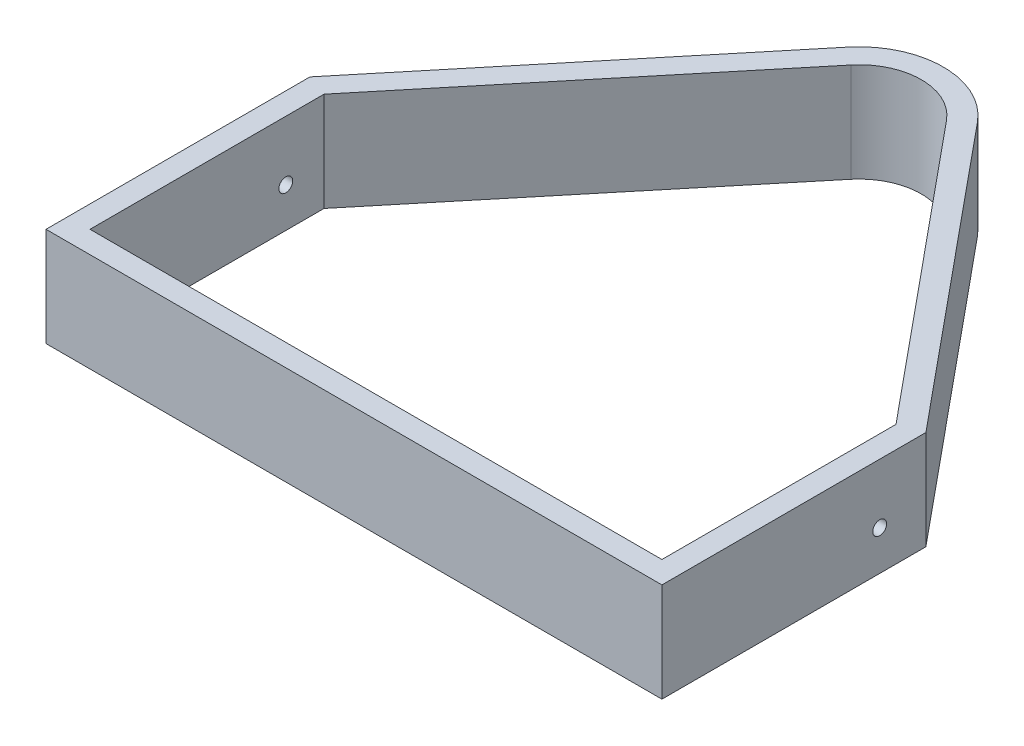
ISO-10303-21;
HEADER;
FILE_DESCRIPTION(('STEP AP214'),'2;1');
FILE_NAME('part.step','',(''),(''),'','','');
FILE_SCHEMA(('AUTOMOTIVE_DESIGN { 1 0 10303 214 1 1 1 1 }'));
ENDSEC;
DATA;
#1=APPLICATION_CONTEXT('core data for automotive mechanical design processes');
#2=APPLICATION_PROTOCOL_DEFINITION('international standard','automotive_design',2000,#1);
#3=PRODUCT_CONTEXT('',#1,'mechanical');
#4=PRODUCT('Part','Part','',(#3));
#5=PRODUCT_RELATED_PRODUCT_CATEGORY('part','',(#4));
#6=PRODUCT_DEFINITION_FORMATION('','',#4);
#7=PRODUCT_DEFINITION_CONTEXT('part definition',#1,'design');
#8=PRODUCT_DEFINITION('design','',#6,#7);
#9=PRODUCT_DEFINITION_SHAPE('','',#8);
#10=(LENGTH_UNIT() NAMED_UNIT(*) SI_UNIT(.MILLI.,.METRE.));
#11=(NAMED_UNIT(*) PLANE_ANGLE_UNIT() SI_UNIT($,.RADIAN.));
#12=(NAMED_UNIT(*) SI_UNIT($,.STERADIAN.) SOLID_ANGLE_UNIT());
#13=UNCERTAINTY_MEASURE_WITH_UNIT(LENGTH_MEASURE(1.E-05),#10,'distance_accuracy_value','');
#14=(GEOMETRIC_REPRESENTATION_CONTEXT(3) GLOBAL_UNCERTAINTY_ASSIGNED_CONTEXT((#13)) GLOBAL_UNIT_ASSIGNED_CONTEXT((#10,
#11,#12)) REPRESENTATION_CONTEXT('',''));
#15=CARTESIAN_POINT('',(0.,0.,0.));
#16=DIRECTION('',(0.,0.,1.));
#17=DIRECTION('',(1.,0.,0.));
#18=AXIS2_PLACEMENT_3D('',#15,#16,#17);
#19=CARTESIAN_POINT('',(0.,28.575,-145.86307345283));
#20=DIRECTION('',(0.,-1.,0.));
#21=DIRECTION('',(0.,0.,-1.));
#22=AXIS2_PLACEMENT_3D('',#19,#20,#21);
#23=PLANE('',#22);
#24=DIRECTION('',(0.,0.,-1.));
#25=VECTOR('',#24,1.);
#26=CARTESIAN_POINT('',(88.9,28.575,0.));
#27=LINE('',#26,#25);
#28=CARTESIAN_POINT('',(88.9,28.575,0.));
#29=VERTEX_POINT('',#28);
#30=CARTESIAN_POINT('',(88.9,28.575,-76.2));
#31=VERTEX_POINT('',#30);
#32=EDGE_CURVE('E177',#29,#31,#27,.T.);
#33=ORIENTED_EDGE('',*,*,#32,.T.);
#34=DIRECTION('',(-0.636363636363636,0.,-0.77138921583987));
#35=VECTOR('',#34,1.);
#36=CARTESIAN_POINT('',(18.7026821694994,28.575,-161.291999072665));
#37=LINE('',#36,#35);
#38=CARTESIAN_POINT('',(18.7026821694994,28.575,-161.291999072665));
#39=VERTEX_POINT('',#38);
#40=EDGE_CURVE('E180',#31,#39,#37,.T.);
#41=ORIENTED_EDGE('',*,*,#40,.T.);
#42=CARTESIAN_POINT('',(0.,28.575,-145.86307345283));
#43=DIRECTION('',(0.,1.,0.));
#44=DIRECTION('',(0.,0.,-1.));
#45=AXIS2_PLACEMENT_3D('',#42,#43,#44);
#46=CIRCLE('',#45,24.2454545454545);
#47=CARTESIAN_POINT('',(-18.7026821694994,28.575,-161.291999072665));
#48=VERTEX_POINT('',#47);
#49=EDGE_CURVE('E183',#39,#48,#46,.T.);
#50=ORIENTED_EDGE('',*,*,#49,.T.);
#51=DIRECTION('',(-0.636363636363636,0.,0.77138921583987));
#52=VECTOR('',#51,1.);
#53=CARTESIAN_POINT('',(-88.9,28.575,-76.2));
#54=LINE('',#53,#52);
#55=CARTESIAN_POINT('',(-88.9,28.575,-76.2));
#56=VERTEX_POINT('',#55);
#57=EDGE_CURVE('E185',#48,#56,#54,.T.);
#58=ORIENTED_EDGE('',*,*,#57,.T.);
#59=DIRECTION('',(0.,0.,1.));
#60=VECTOR('',#59,1.);
#61=CARTESIAN_POINT('',(-88.9,28.575,0.));
#62=LINE('',#61,#60);
#63=CARTESIAN_POINT('',(-88.9,28.575,0.));
#64=VERTEX_POINT('',#63);
#65=EDGE_CURVE('E187',#56,#64,#62,.T.);
#66=ORIENTED_EDGE('',*,*,#65,.T.);
#67=DIRECTION('',(1.,0.,0.));
#68=VECTOR('',#67,1.);
#69=CARTESIAN_POINT('',(-88.9,28.575,0.));
#70=LINE('',#69,#68);
#71=EDGE_CURVE('E189',#64,#29,#70,.T.);
#72=ORIENTED_EDGE('',*,*,#71,.T.);
#73=EDGE_LOOP('',(#33,#41,#50,#58,#66,#72));
#74=FACE_BOUND('',#73,.T.);
#75=DIRECTION('',(1.,0.,0.));
#76=VECTOR('',#75,1.);
#77=CARTESIAN_POINT('',(-82.55,28.575,-6.35));
#78=LINE('',#77,#76);
#79=CARTESIAN_POINT('',(-82.55,28.575,-6.35));
#80=VERTEX_POINT('',#79);
#81=CARTESIAN_POINT('',(82.55,28.575,-6.35));
#82=VERTEX_POINT('',#81);
#83=EDGE_CURVE('E124',#80,#82,#78,.T.);
#84=ORIENTED_EDGE('',*,*,#83,.F.);
#85=DIRECTION('',(0.,0.,1.));
#86=VECTOR('',#85,1.);
#87=CARTESIAN_POINT('',(-82.55,28.575,-6.35));
#88=LINE('',#87,#86);
#89=CARTESIAN_POINT('',(-82.55,28.575,-73.9187909609164));
#90=VERTEX_POINT('',#89);
#91=EDGE_CURVE('E154',#90,#80,#88,.T.);
#92=ORIENTED_EDGE('',*,*,#91,.F.);
#93=DIRECTION('',(-0.636363636363636,0.,0.77138921583987));
#94=VECTOR('',#93,1.);
#95=CARTESIAN_POINT('',(-82.55,28.575,-73.9187909609164));
#96=LINE('',#95,#94);
#97=CARTESIAN_POINT('',(-13.8043606489163,28.575,-157.251089981755));
#98=VERTEX_POINT('',#97);
#99=EDGE_CURVE('E152',#98,#90,#96,.T.);
#100=ORIENTED_EDGE('',*,*,#99,.F.);
#101=CARTESIAN_POINT('',(0.,28.575,-145.86307345283));
#102=DIRECTION('',(0.,1.,0.));
#103=DIRECTION('',(0.,0.,-1.));
#104=AXIS2_PLACEMENT_3D('',#101,#102,#103);
#105=CIRCLE('',#104,17.8954545454546);
#106=CARTESIAN_POINT('',(13.8043606489162,28.575,-157.251089981755));
#107=VERTEX_POINT('',#106);
#108=EDGE_CURVE('E147',#107,#98,#105,.T.);
#109=ORIENTED_EDGE('',*,*,#108,.F.);
#110=DIRECTION('',(-0.636363636363636,0.,-0.77138921583987));
#111=VECTOR('',#110,1.);
#112=CARTESIAN_POINT('',(13.8043606489162,28.575,-157.251089981755));
#113=LINE('',#112,#111);
#114=CARTESIAN_POINT('',(82.55,28.575,-73.9187909609164));
#115=VERTEX_POINT('',#114);
#116=EDGE_CURVE('E145',#115,#107,#113,.T.);
#117=ORIENTED_EDGE('',*,*,#116,.F.);
#118=DIRECTION('',(0.,0.,-1.));
#119=VECTOR('',#118,1.);
#120=CARTESIAN_POINT('',(82.55,28.575,-6.35));
#121=LINE('',#120,#119);
#122=EDGE_CURVE('E132',#82,#115,#121,.T.);
#123=ORIENTED_EDGE('',*,*,#122,.F.);
#124=EDGE_LOOP('',(#84,#92,#100,#109,#117,#123));
#125=FACE_BOUND('',#124,.T.);
#126=ADVANCED_FACE('F35',(#74,#125),#23,.F.);
#127=CARTESIAN_POINT('',(0.,0.,-145.86307345283));
#128=DIRECTION('',(0.,-1.,0.));
#129=DIRECTION('',(0.,0.,-1.));
#130=AXIS2_PLACEMENT_3D('',#127,#128,#129);
#131=PLANE('',#130);
#132=DIRECTION('',(0.,0.,-1.));
#133=VECTOR('',#132,1.);
#134=CARTESIAN_POINT('',(88.9,0.,0.));
#135=LINE('',#134,#133);
#136=CARTESIAN_POINT('',(88.9,0.,0.));
#137=VERTEX_POINT('',#136);
#138=CARTESIAN_POINT('',(88.9,0.,-76.2));
#139=VERTEX_POINT('',#138);
#140=EDGE_CURVE('E140',#137,#139,#135,.T.);
#141=ORIENTED_EDGE('',*,*,#140,.F.);
#142=DIRECTION('',(1.,0.,0.));
#143=VECTOR('',#142,1.);
#144=CARTESIAN_POINT('',(-88.9,0.,0.));
#145=LINE('',#144,#143);
#146=CARTESIAN_POINT('',(-88.9,0.,0.));
#147=VERTEX_POINT('',#146);
#148=EDGE_CURVE('E181',#147,#137,#145,.T.);
#149=ORIENTED_EDGE('',*,*,#148,.F.);
#150=DIRECTION('',(0.,0.,1.));
#151=VECTOR('',#150,1.);
#152=CARTESIAN_POINT('',(-88.9,0.,0.));
#153=LINE('',#152,#151);
#154=CARTESIAN_POINT('',(-88.9,0.,-76.2));
#155=VERTEX_POINT('',#154);
#156=EDGE_CURVE('E200',#155,#147,#153,.T.);
#157=ORIENTED_EDGE('',*,*,#156,.F.);
#158=DIRECTION('',(-0.636363636363636,0.,0.77138921583987));
#159=VECTOR('',#158,1.);
#160=CARTESIAN_POINT('',(-88.9,0.,-76.2));
#161=LINE('',#160,#159);
#162=CARTESIAN_POINT('',(-18.7026821694994,0.,-161.291999072665));
#163=VERTEX_POINT('',#162);
#164=EDGE_CURVE('E198',#163,#155,#161,.T.);
#165=ORIENTED_EDGE('',*,*,#164,.F.);
#166=CARTESIAN_POINT('',(0.,0.,-145.86307345283));
#167=DIRECTION('',(0.,1.,0.));
#168=DIRECTION('',(0.,0.,-1.));
#169=AXIS2_PLACEMENT_3D('',#166,#167,#168);
#170=CIRCLE('',#169,24.2454545454545);
#171=CARTESIAN_POINT('',(18.7026821694994,0.,-161.291999072665));
#172=VERTEX_POINT('',#171);
#173=EDGE_CURVE('E196',#172,#163,#170,.T.);
#174=ORIENTED_EDGE('',*,*,#173,.F.);
#175=DIRECTION('',(-0.636363636363636,0.,-0.77138921583987));
#176=VECTOR('',#175,1.);
#177=CARTESIAN_POINT('',(18.7026821694994,0.,-161.291999072665));
#178=LINE('',#177,#176);
#179=EDGE_CURVE('E194',#139,#172,#178,.T.);
#180=ORIENTED_EDGE('',*,*,#179,.F.);
#181=EDGE_LOOP('',(#141,#149,#157,#165,#174,#180));
#182=FACE_BOUND('',#181,.T.);
#183=DIRECTION('',(0.,0.,1.));
#184=VECTOR('',#183,1.);
#185=CARTESIAN_POINT('',(-82.55,0.,-6.35));
#186=LINE('',#185,#184);
#187=CARTESIAN_POINT('',(-82.55,0.,-73.9187909609164));
#188=VERTEX_POINT('',#187);
#189=CARTESIAN_POINT('',(-82.55,0.,-6.34999999999999));
#190=VERTEX_POINT('',#189);
#191=EDGE_CURVE('E133',#188,#190,#186,.T.);
#192=ORIENTED_EDGE('',*,*,#191,.T.);
#193=DIRECTION('',(1.,0.,0.));
#194=VECTOR('',#193,1.);
#195=CARTESIAN_POINT('',(-82.55,0.,-6.35));
#196=LINE('',#195,#194);
#197=CARTESIAN_POINT('',(82.55,0.,-6.35));
#198=VERTEX_POINT('',#197);
#199=EDGE_CURVE('E58',#190,#198,#196,.T.);
#200=ORIENTED_EDGE('',*,*,#199,.T.);
#201=DIRECTION('',(0.,0.,-1.));
#202=VECTOR('',#201,1.);
#203=CARTESIAN_POINT('',(82.55,0.,-6.35));
#204=LINE('',#203,#202);
#205=CARTESIAN_POINT('',(82.55,0.,-73.9187909609164));
#206=VERTEX_POINT('',#205);
#207=EDGE_CURVE('E139',#198,#206,#204,.T.);
#208=ORIENTED_EDGE('',*,*,#207,.T.);
#209=DIRECTION('',(-0.636363636363636,0.,-0.77138921583987));
#210=VECTOR('',#209,1.);
#211=CARTESIAN_POINT('',(13.8043606489162,0.,-157.251089981755));
#212=LINE('',#211,#210);
#213=CARTESIAN_POINT('',(13.8043606489162,0.,-157.251089981755));
#214=VERTEX_POINT('',#213);
#215=EDGE_CURVE('E159',#206,#214,#212,.T.);
#216=ORIENTED_EDGE('',*,*,#215,.T.);
#217=CARTESIAN_POINT('',(0.,0.,-145.86307345283));
#218=DIRECTION('',(0.,1.,0.));
#219=DIRECTION('',(0.,0.,-1.));
#220=AXIS2_PLACEMENT_3D('',#217,#218,#219);
#221=CIRCLE('',#220,17.8954545454546);
#222=CARTESIAN_POINT('',(-13.8043606489163,0.,-157.251089981755));
#223=VERTEX_POINT('',#222);
#224=EDGE_CURVE('E162',#214,#223,#221,.T.);
#225=ORIENTED_EDGE('',*,*,#224,.T.);
#226=DIRECTION('',(-0.636363636363636,0.,0.77138921583987));
#227=VECTOR('',#226,1.);
#228=CARTESIAN_POINT('',(-82.55,0.,-73.9187909609164));
#229=LINE('',#228,#227);
#230=EDGE_CURVE('E165',#223,#188,#229,.T.);
#231=ORIENTED_EDGE('',*,*,#230,.T.);
#232=EDGE_LOOP('',(#192,#200,#208,#216,#225,#231));
#233=FACE_BOUND('',#232,.T.);
#234=ADVANCED_FACE('F224',(#182,#233),#131,.T.);
#235=CARTESIAN_POINT('',(88.9,28.575,0.));
#236=DIRECTION('',(-1.,0.,0.));
#237=DIRECTION('',(0.,0.,1.));
#238=AXIS2_PLACEMENT_3D('',#235,#236,#237);
#239=PLANE('',#238);
#240=CARTESIAN_POINT('',(88.9,11.43,-62.8697909609164));
#241=DIRECTION('',(-1.,0.,0.));
#242=DIRECTION('',(0.,0.,1.));
#243=AXIS2_PLACEMENT_3D('',#240,#241,#242);
#244=CIRCLE('',#243,2.);
#245=CARTESIAN_POINT('',(88.9,11.43,-60.8697909609164));
#246=VERTEX_POINT('',#245);
#247=EDGE_CURVE('E295',#246,#246,#244,.F.);
#248=ORIENTED_EDGE('',*,*,#247,.F.);
#249=EDGE_LOOP('',(#248));
#250=FACE_BOUND('',#249,.T.);
#251=ORIENTED_EDGE('',*,*,#140,.T.);
#252=DIRECTION('',(0.,-1.,0.));
#253=VECTOR('',#252,1.);
#254=CARTESIAN_POINT('',(88.9,28.575,-76.2));
#255=LINE('',#254,#253);
#256=EDGE_CURVE('E11',#31,#139,#255,.T.);
#257=ORIENTED_EDGE('',*,*,#256,.F.);
#258=ORIENTED_EDGE('',*,*,#32,.F.);
#259=DIRECTION('',(0.,-1.,0.));
#260=VECTOR('',#259,1.);
#261=CARTESIAN_POINT('',(88.9,28.575,0.));
#262=LINE('',#261,#260);
#263=EDGE_CURVE('E191',#29,#137,#262,.T.);
#264=ORIENTED_EDGE('',*,*,#263,.T.);
#265=EDGE_LOOP('',(#251,#257,#258,#264));
#266=FACE_BOUND('',#265,.T.);
#267=ADVANCED_FACE('F37',(#250,#266),#239,.F.);
#268=CARTESIAN_POINT('',(18.7026821694994,28.575,-161.291999072665));
#269=DIRECTION('',(-0.77138921583987,0.,0.636363636363636));
#270=DIRECTION('',(0.636363636363636,0.,0.77138921583987));
#271=AXIS2_PLACEMENT_3D('',#268,#269,#270);
#272=PLANE('',#271);
#273=ORIENTED_EDGE('',*,*,#179,.T.);
#274=DIRECTION('',(0.,-1.,0.));
#275=VECTOR('',#274,1.);
#276=CARTESIAN_POINT('',(18.7026821694994,28.575,-161.291999072665));
#277=LINE('',#276,#275);
#278=EDGE_CURVE('E43',#39,#172,#277,.T.);
#279=ORIENTED_EDGE('',*,*,#278,.F.);
#280=ORIENTED_EDGE('',*,*,#40,.F.);
#281=ORIENTED_EDGE('',*,*,#256,.T.);
#282=EDGE_LOOP('',(#273,#279,#280,#281));
#283=FACE_BOUND('',#282,.T.);
#284=ADVANCED_FACE('F241',(#283),#272,.F.);
#285=CARTESIAN_POINT('',(0.,28.575,-145.86307345283));
#286=DIRECTION('',(0.,-1.,0.));
#287=DIRECTION('',(0.,0.,-1.));
#288=AXIS2_PLACEMENT_3D('',#285,#286,#287);
#289=CYLINDRICAL_SURFACE('',#288,24.2454545454545);
#290=ORIENTED_EDGE('',*,*,#173,.T.);
#291=DIRECTION('',(0.,-1.,0.));
#292=VECTOR('',#291,1.);
#293=CARTESIAN_POINT('',(-18.7026821694994,28.575,-161.291999072665));
#294=LINE('',#293,#292);
#295=EDGE_CURVE('E211',#48,#163,#294,.T.);
#296=ORIENTED_EDGE('',*,*,#295,.F.);
#297=ORIENTED_EDGE('',*,*,#49,.F.);
#298=ORIENTED_EDGE('',*,*,#278,.T.);
#299=EDGE_LOOP('',(#290,#296,#297,#298));
#300=FACE_BOUND('',#299,.T.);
#301=ADVANCED_FACE('F218',(#300),#289,.T.);
#302=CARTESIAN_POINT('',(-88.9,28.575,-76.2));
#303=DIRECTION('',(0.77138921583987,0.,0.636363636363636));
#304=DIRECTION('',(0.636363636363636,0.,-0.77138921583987));
#305=AXIS2_PLACEMENT_3D('',#302,#303,#304);
#306=PLANE('',#305);
#307=ORIENTED_EDGE('',*,*,#164,.T.);
#308=DIRECTION('',(0.,-1.,0.));
#309=VECTOR('',#308,1.);
#310=CARTESIAN_POINT('',(-88.9,28.575,-76.2));
#311=LINE('',#310,#309);
#312=EDGE_CURVE('E208',#56,#155,#311,.T.);
#313=ORIENTED_EDGE('',*,*,#312,.F.);
#314=ORIENTED_EDGE('',*,*,#57,.F.);
#315=ORIENTED_EDGE('',*,*,#295,.T.);
#316=EDGE_LOOP('',(#307,#313,#314,#315));
#317=FACE_BOUND('',#316,.T.);
#318=ADVANCED_FACE('F230',(#317),#306,.F.);
#319=CARTESIAN_POINT('',(-88.9,28.575,0.));
#320=DIRECTION('',(1.,0.,0.));
#321=DIRECTION('',(0.,0.,-1.));
#322=AXIS2_PLACEMENT_3D('',#319,#320,#321);
#323=PLANE('',#322);
#324=CARTESIAN_POINT('',(-88.9,11.43,-62.8697909609164));
#325=DIRECTION('',(1.,0.,0.));
#326=DIRECTION('',(0.,0.,-1.));
#327=AXIS2_PLACEMENT_3D('',#324,#325,#326);
#328=CIRCLE('',#327,2.);
#329=CARTESIAN_POINT('',(-88.9,11.43,-64.8697909609164));
#330=VERTEX_POINT('',#329);
#331=EDGE_CURVE('E157',#330,#330,#328,.F.);
#332=ORIENTED_EDGE('',*,*,#331,.F.);
#333=EDGE_LOOP('',(#332));
#334=FACE_BOUND('',#333,.T.);
#335=ORIENTED_EDGE('',*,*,#156,.T.);
#336=DIRECTION('',(0.,-1.,0.));
#337=VECTOR('',#336,1.);
#338=CARTESIAN_POINT('',(-88.9,28.575,0.));
#339=LINE('',#338,#337);
#340=EDGE_CURVE('E205',#64,#147,#339,.T.);
#341=ORIENTED_EDGE('',*,*,#340,.F.);
#342=ORIENTED_EDGE('',*,*,#65,.F.);
#343=ORIENTED_EDGE('',*,*,#312,.T.);
#344=EDGE_LOOP('',(#335,#341,#342,#343));
#345=FACE_BOUND('',#344,.T.);
#346=ADVANCED_FACE('F234',(#334,#345),#323,.F.);
#347=CARTESIAN_POINT('',(-88.9,28.575,0.));
#348=DIRECTION('',(0.,0.,-1.));
#349=DIRECTION('',(-1.,0.,0.));
#350=AXIS2_PLACEMENT_3D('',#347,#348,#349);
#351=PLANE('',#350);
#352=ORIENTED_EDGE('',*,*,#148,.T.);
#353=ORIENTED_EDGE('',*,*,#263,.F.);
#354=ORIENTED_EDGE('',*,*,#71,.F.);
#355=ORIENTED_EDGE('',*,*,#340,.T.);
#356=EDGE_LOOP('',(#352,#353,#354,#355));
#357=FACE_BOUND('',#356,.T.);
#358=ADVANCED_FACE('F244',(#357),#351,.F.);
#359=CARTESIAN_POINT('',(-82.55,28.575,-6.35));
#360=DIRECTION('',(0.,0.,-1.));
#361=DIRECTION('',(-1.,0.,0.));
#362=AXIS2_PLACEMENT_3D('',#359,#360,#361);
#363=PLANE('',#362);
#364=ORIENTED_EDGE('',*,*,#199,.F.);
#365=DIRECTION('',(0.,-1.,0.));
#366=VECTOR('',#365,1.);
#367=CARTESIAN_POINT('',(-82.55,28.575,-6.35));
#368=LINE('',#367,#366);
#369=EDGE_CURVE('E128',#80,#190,#368,.T.);
#370=ORIENTED_EDGE('',*,*,#369,.F.);
#371=ORIENTED_EDGE('',*,*,#83,.T.);
#372=DIRECTION('',(0.,-1.,0.));
#373=VECTOR('',#372,1.);
#374=CARTESIAN_POINT('',(82.55,28.575,-6.35));
#375=LINE('',#374,#373);
#376=EDGE_CURVE('E127',#82,#198,#375,.T.);
#377=ORIENTED_EDGE('',*,*,#376,.T.);
#378=EDGE_LOOP('',(#364,#370,#371,#377));
#379=FACE_BOUND('',#378,.T.);
#380=ADVANCED_FACE('F126',(#379),#363,.T.);
#381=CARTESIAN_POINT('',(82.55,28.575,-6.35));
#382=DIRECTION('',(-1.,0.,0.));
#383=DIRECTION('',(0.,0.,1.));
#384=AXIS2_PLACEMENT_3D('',#381,#382,#383);
#385=PLANE('',#384);
#386=CARTESIAN_POINT('',(82.55,11.43,-62.8697909609164));
#387=DIRECTION('',(-1.,0.,0.));
#388=DIRECTION('',(0.,0.,1.));
#389=AXIS2_PLACEMENT_3D('',#386,#387,#388);
#390=CIRCLE('',#389,2.);
#391=CARTESIAN_POINT('',(82.55,11.43,-60.8697909609164));
#392=VERTEX_POINT('',#391);
#393=EDGE_CURVE('E292',#392,#392,#390,.T.);
#394=ORIENTED_EDGE('',*,*,#393,.F.);
#395=EDGE_LOOP('',(#394));
#396=FACE_BOUND('',#395,.T.);
#397=ORIENTED_EDGE('',*,*,#207,.F.);
#398=ORIENTED_EDGE('',*,*,#376,.F.);
#399=ORIENTED_EDGE('',*,*,#122,.T.);
#400=DIRECTION('',(0.,-1.,0.));
#401=VECTOR('',#400,1.);
#402=CARTESIAN_POINT('',(82.55,28.575,-73.9187909609164));
#403=LINE('',#402,#401);
#404=EDGE_CURVE('E141',#115,#206,#403,.T.);
#405=ORIENTED_EDGE('',*,*,#404,.T.);
#406=EDGE_LOOP('',(#397,#398,#399,#405));
#407=FACE_BOUND('',#406,.T.);
#408=ADVANCED_FACE('F136',(#396,#407),#385,.T.);
#409=CARTESIAN_POINT('',(13.8043606489162,28.575,-157.251089981755));
#410=DIRECTION('',(-0.77138921583987,0.,0.636363636363636));
#411=DIRECTION('',(0.636363636363636,0.,0.77138921583987));
#412=AXIS2_PLACEMENT_3D('',#409,#410,#411);
#413=PLANE('',#412);
#414=ORIENTED_EDGE('',*,*,#215,.F.);
#415=ORIENTED_EDGE('',*,*,#404,.F.);
#416=ORIENTED_EDGE('',*,*,#116,.T.);
#417=DIRECTION('',(0.,-1.,0.));
#418=VECTOR('',#417,1.);
#419=CARTESIAN_POINT('',(13.8043606489162,28.575,-157.251089981755));
#420=LINE('',#419,#418);
#421=EDGE_CURVE('E174',#107,#214,#420,.T.);
#422=ORIENTED_EDGE('',*,*,#421,.T.);
#423=EDGE_LOOP('',(#414,#415,#416,#422));
#424=FACE_BOUND('',#423,.T.);
#425=ADVANCED_FACE('F263',(#424),#413,.T.);
#426=CARTESIAN_POINT('',(0.,28.575,-145.86307345283));
#427=DIRECTION('',(0.,-1.,0.));
#428=DIRECTION('',(0.,0.,-1.));
#429=AXIS2_PLACEMENT_3D('',#426,#427,#428);
#430=CYLINDRICAL_SURFACE('',#429,17.8954545454546);
#431=ORIENTED_EDGE('',*,*,#224,.F.);
#432=ORIENTED_EDGE('',*,*,#421,.F.);
#433=ORIENTED_EDGE('',*,*,#108,.T.);
#434=DIRECTION('',(0.,-1.,0.));
#435=VECTOR('',#434,1.);
#436=CARTESIAN_POINT('',(-13.8043606489163,28.575,-157.251089981755));
#437=LINE('',#436,#435);
#438=EDGE_CURVE('E172',#98,#223,#437,.T.);
#439=ORIENTED_EDGE('',*,*,#438,.T.);
#440=EDGE_LOOP('',(#431,#432,#433,#439));
#441=FACE_BOUND('',#440,.T.);
#442=ADVANCED_FACE('F267',(#441),#430,.F.);
#443=CARTESIAN_POINT('',(-82.55,28.575,-73.9187909609164));
#444=DIRECTION('',(0.77138921583987,0.,0.636363636363636));
#445=DIRECTION('',(0.636363636363636,0.,-0.77138921583987));
#446=AXIS2_PLACEMENT_3D('',#443,#444,#445);
#447=PLANE('',#446);
#448=ORIENTED_EDGE('',*,*,#230,.F.);
#449=ORIENTED_EDGE('',*,*,#438,.F.);
#450=ORIENTED_EDGE('',*,*,#99,.T.);
#451=DIRECTION('',(0.,-1.,0.));
#452=VECTOR('',#451,1.);
#453=CARTESIAN_POINT('',(-82.55,28.575,-73.9187909609164));
#454=LINE('',#453,#452);
#455=EDGE_CURVE('E50',#90,#188,#454,.T.);
#456=ORIENTED_EDGE('',*,*,#455,.T.);
#457=EDGE_LOOP('',(#448,#449,#450,#456));
#458=FACE_BOUND('',#457,.T.);
#459=ADVANCED_FACE('F271',(#458),#447,.T.);
#460=CARTESIAN_POINT('',(-82.55,28.575,-6.35));
#461=DIRECTION('',(1.,0.,0.));
#462=DIRECTION('',(0.,0.,-1.));
#463=AXIS2_PLACEMENT_3D('',#460,#461,#462);
#464=PLANE('',#463);
#465=CARTESIAN_POINT('',(-82.55,11.43,-62.8697909609164));
#466=DIRECTION('',(1.,0.,0.));
#467=DIRECTION('',(0.,0.,-1.));
#468=AXIS2_PLACEMENT_3D('',#465,#466,#467);
#469=CIRCLE('',#468,2.);
#470=CARTESIAN_POINT('',(-82.55,11.43,-64.8697909609164));
#471=VERTEX_POINT('',#470);
#472=EDGE_CURVE('E297',#471,#471,#469,.T.);
#473=ORIENTED_EDGE('',*,*,#472,.F.);
#474=EDGE_LOOP('',(#473));
#475=FACE_BOUND('',#474,.T.);
#476=ORIENTED_EDGE('',*,*,#191,.F.);
#477=ORIENTED_EDGE('',*,*,#455,.F.);
#478=ORIENTED_EDGE('',*,*,#91,.T.);
#479=ORIENTED_EDGE('',*,*,#369,.T.);
#480=EDGE_LOOP('',(#476,#477,#478,#479));
#481=FACE_BOUND('',#480,.T.);
#482=ADVANCED_FACE('F275',(#475,#481),#464,.T.);
#483=CARTESIAN_POINT('',(-88.901,11.43,-62.8697909609164));
#484=DIRECTION('',(1.,0.,0.));
#485=DIRECTION('',(0.,0.,-1.));
#486=AXIS2_PLACEMENT_3D('',#483,#484,#485);
#487=CYLINDRICAL_SURFACE('',#486,2.);
#488=CARTESIAN_POINT('',(-82.55,11.43,-64.8697909609164));
#489=CARTESIAN_POINT('',(-82.6161458333333,11.43,-64.8697909609164));
#490=CARTESIAN_POINT('',(-82.6822916666667,11.43,-64.8697909609164));
#491=CARTESIAN_POINT('',(-82.8145833333333,11.43,-64.8697909609164));
#492=CARTESIAN_POINT('',(-82.8807291666667,11.43,-64.8697909609164));
#493=CARTESIAN_POINT('',(-83.0130208333333,11.43,-64.8697909609164));
#494=CARTESIAN_POINT('',(-83.0791666666667,11.43,-64.8697909609164));
#495=CARTESIAN_POINT('',(-83.2114583333333,11.43,-64.8697909609164));
#496=CARTESIAN_POINT('',(-83.2776041666667,11.43,-64.8697909609164));
#497=CARTESIAN_POINT('',(-83.4098958333334,11.43,-64.8697909609164));
#498=CARTESIAN_POINT('',(-83.4760416666667,11.43,-64.8697909609164));
#499=CARTESIAN_POINT('',(-83.6083333333333,11.43,-64.8697909609164));
#500=CARTESIAN_POINT('',(-83.6744791666667,11.43,-64.8697909609164));
#501=CARTESIAN_POINT('',(-83.8067708333333,11.43,-64.8697909609164));
#502=CARTESIAN_POINT('',(-83.8729166666667,11.43,-64.8697909609164));
#503=CARTESIAN_POINT('',(-84.0052083333333,11.43,-64.8697909609164));
#504=CARTESIAN_POINT('',(-84.0713541666667,11.43,-64.8697909609164));
#505=CARTESIAN_POINT('',(-84.2036458333333,11.43,-64.8697909609164));
#506=CARTESIAN_POINT('',(-84.2697916666667,11.43,-64.8697909609164));
#507=CARTESIAN_POINT('',(-84.4020833333333,11.43,-64.8697909609164));
#508=CARTESIAN_POINT('',(-84.4682291666667,11.43,-64.8697909609164));
#509=CARTESIAN_POINT('',(-84.6005208333333,11.43,-64.8697909609164));
#510=CARTESIAN_POINT('',(-84.6666666666667,11.43,-64.8697909609164));
#511=CARTESIAN_POINT('',(-84.7989583333333,11.43,-64.8697909609164));
#512=CARTESIAN_POINT('',(-84.8651041666667,11.43,-64.8697909609164));
#513=CARTESIAN_POINT('',(-84.9973958333333,11.43,-64.8697909609164));
#514=CARTESIAN_POINT('',(-85.0635416666667,11.43,-64.8697909609164));
#515=CARTESIAN_POINT('',(-85.1958333333333,11.43,-64.8697909609164));
#516=CARTESIAN_POINT('',(-85.2619791666667,11.43,-64.8697909609164));
#517=CARTESIAN_POINT('',(-85.3942708333333,11.43,-64.8697909609164));
#518=CARTESIAN_POINT('',(-85.4604166666667,11.43,-64.8697909609164));
#519=CARTESIAN_POINT('',(-85.5927083333333,11.43,-64.8697909609164));
#520=CARTESIAN_POINT('',(-85.6588541666667,11.43,-64.8697909609164));
#521=CARTESIAN_POINT('',(-85.7911458333333,11.43,-64.8697909609164));
#522=CARTESIAN_POINT('',(-85.8572916666667,11.43,-64.8697909609164));
#523=CARTESIAN_POINT('',(-85.9895833333333,11.43,-64.8697909609164));
#524=CARTESIAN_POINT('',(-86.0557291666667,11.43,-64.8697909609164));
#525=CARTESIAN_POINT('',(-86.1880208333333,11.43,-64.8697909609164));
#526=CARTESIAN_POINT('',(-86.2541666666667,11.43,-64.8697909609164));
#527=CARTESIAN_POINT('',(-86.3864583333333,11.43,-64.8697909609164));
#528=CARTESIAN_POINT('',(-86.4526041666667,11.43,-64.8697909609164));
#529=CARTESIAN_POINT('',(-86.5848958333333,11.43,-64.8697909609164));
#530=CARTESIAN_POINT('',(-86.6510416666667,11.43,-64.8697909609164));
#531=CARTESIAN_POINT('',(-86.7833333333333,11.43,-64.8697909609164));
#532=CARTESIAN_POINT('',(-86.8494791666667,11.43,-64.8697909609164));
#533=CARTESIAN_POINT('',(-86.9817708333333,11.43,-64.8697909609164));
#534=CARTESIAN_POINT('',(-87.0479166666667,11.43,-64.8697909609164));
#535=CARTESIAN_POINT('',(-87.1802083333333,11.43,-64.8697909609164));
#536=CARTESIAN_POINT('',(-87.2463541666667,11.43,-64.8697909609164));
#537=CARTESIAN_POINT('',(-87.3786458333333,11.43,-64.8697909609164));
#538=CARTESIAN_POINT('',(-87.4447916666667,11.43,-64.8697909609164));
#539=CARTESIAN_POINT('',(-87.5770833333333,11.43,-64.8697909609164));
#540=CARTESIAN_POINT('',(-87.6432291666667,11.43,-64.8697909609164));
#541=CARTESIAN_POINT('',(-87.7755208333333,11.43,-64.8697909609164));
#542=CARTESIAN_POINT('',(-87.8416666666667,11.43,-64.8697909609164));
#543=CARTESIAN_POINT('',(-87.9739583333333,11.43,-64.8697909609164));
#544=CARTESIAN_POINT('',(-88.0401041666667,11.43,-64.8697909609164));
#545=CARTESIAN_POINT('',(-88.1723958333333,11.43,-64.8697909609164));
#546=CARTESIAN_POINT('',(-88.2385416666667,11.43,-64.8697909609164));
#547=CARTESIAN_POINT('',(-88.3708333333333,11.43,-64.8697909609164));
#548=CARTESIAN_POINT('',(-88.4369791666667,11.43,-64.8697909609164));
#549=CARTESIAN_POINT('',(-88.5692708333333,11.43,-64.8697909609164));
#550=CARTESIAN_POINT('',(-88.6354166666667,11.43,-64.8697909609164));
#551=CARTESIAN_POINT('',(-88.7677083333333,11.43,-64.8697909609164));
#552=CARTESIAN_POINT('',(-88.8338541666667,11.43,-64.8697909609164));
#553=CARTESIAN_POINT('',(-88.9,11.43,-64.8697909609164));
#554=B_SPLINE_CURVE_WITH_KNOTS('',3,(#488,#489,#490,#491,#492,#493,#494,#495,#496,#497,#498,
#499,#500,#501,#502,#503,#504,#505,#506,#507,#508,#509,#510,#511,#512,#513,#514,#515,#516,#517,
#518,#519,#520,#521,#522,#523,#524,#525,#526,#527,#528,#529,#530,#531,#532,#533,#534,#535,#536,
#537,#538,#539,#540,#541,#542,#543,#544,#545,#546,#547,#548,#549,#550,#551,#552,#553),
.UNSPECIFIED.,.F.,.F.,(4,2,2,2,2,2,2,2,2,2,2,2,2,2,2,2,2,2,2,2,2,2,2,2,2,2,2,2,2,2,2,2,4),(0.,
0.198437500000009,0.396875000000005,0.5953125,0.79375000000001,0.992187500000005,1.190625,
1.38906250000001,1.58750000000001,1.7859375,1.98437500000001,2.18281250000001,2.38125,
2.57968750000001,2.77812500000001,2.9765625,3.175,3.37343750000001,3.571875,3.7703125,
3.96875000000001,4.1671875,4.365625,4.56406250000001,4.7625,4.9609375,5.15937500000001,
5.3578125,5.55625,5.75468750000001,5.953125,6.1515625,6.35000000000001),.UNSPECIFIED.);
#555=EDGE_CURVE('BSEAM279',#471,#330,#554,.T.);
#556=ORIENTED_EDGE('',*,*,#472,.T.);
#557=ORIENTED_EDGE('',*,*,#331,.T.);
#558=ORIENTED_EDGE('',*,*,#555,.T.);
#559=ORIENTED_EDGE('',*,*,#555,.F.);
#560=EDGE_LOOP('',(#556,#558,#557,#559));
#561=FACE_BOUND('',#560,.T.);
#562=ADVANCED_FACE('F279',(#561),#487,.F.);
#563=CARTESIAN_POINT('',(88.901,11.43,-62.8697909609164));
#564=DIRECTION('',(-1.,0.,0.));
#565=DIRECTION('',(0.,0.,1.));
#566=AXIS2_PLACEMENT_3D('',#563,#564,#565);
#567=CYLINDRICAL_SURFACE('',#566,2.);
#568=CARTESIAN_POINT('',(82.55,11.43,-60.8697909609164));
#569=CARTESIAN_POINT('',(82.6161458333333,11.43,-60.8697909609164));
#570=CARTESIAN_POINT('',(82.6822916666667,11.43,-60.8697909609164));
#571=CARTESIAN_POINT('',(82.8145833333333,11.43,-60.8697909609164));
#572=CARTESIAN_POINT('',(82.8807291666667,11.43,-60.8697909609164));
#573=CARTESIAN_POINT('',(83.0130208333333,11.43,-60.8697909609164));
#574=CARTESIAN_POINT('',(83.0791666666667,11.43,-60.8697909609164));
#575=CARTESIAN_POINT('',(83.2114583333333,11.43,-60.8697909609164));
#576=CARTESIAN_POINT('',(83.2776041666667,11.43,-60.8697909609164));
#577=CARTESIAN_POINT('',(83.4098958333333,11.43,-60.8697909609164));
#578=CARTESIAN_POINT('',(83.4760416666667,11.43,-60.8697909609164));
#579=CARTESIAN_POINT('',(83.6083333333333,11.43,-60.8697909609164));
#580=CARTESIAN_POINT('',(83.6744791666667,11.43,-60.8697909609164));
#581=CARTESIAN_POINT('',(83.8067708333333,11.43,-60.8697909609164));
#582=CARTESIAN_POINT('',(83.8729166666667,11.43,-60.8697909609164));
#583=CARTESIAN_POINT('',(84.0052083333333,11.43,-60.8697909609164));
#584=CARTESIAN_POINT('',(84.0713541666667,11.43,-60.8697909609164));
#585=CARTESIAN_POINT('',(84.2036458333333,11.43,-60.8697909609164));
#586=CARTESIAN_POINT('',(84.2697916666667,11.43,-60.8697909609164));
#587=CARTESIAN_POINT('',(84.4020833333333,11.43,-60.8697909609164));
#588=CARTESIAN_POINT('',(84.4682291666667,11.43,-60.8697909609164));
#589=CARTESIAN_POINT('',(84.6005208333333,11.43,-60.8697909609164));
#590=CARTESIAN_POINT('',(84.6666666666667,11.43,-60.8697909609164));
#591=CARTESIAN_POINT('',(84.7989583333333,11.43,-60.8697909609164));
#592=CARTESIAN_POINT('',(84.8651041666667,11.43,-60.8697909609164));
#593=CARTESIAN_POINT('',(84.9973958333333,11.43,-60.8697909609164));
#594=CARTESIAN_POINT('',(85.0635416666667,11.43,-60.8697909609164));
#595=CARTESIAN_POINT('',(85.1958333333333,11.43,-60.8697909609164));
#596=CARTESIAN_POINT('',(85.2619791666666,11.43,-60.8697909609164));
#597=CARTESIAN_POINT('',(85.3942708333333,11.43,-60.8697909609164));
#598=CARTESIAN_POINT('',(85.4604166666666,11.43,-60.8697909609164));
#599=CARTESIAN_POINT('',(85.5927083333333,11.43,-60.8697909609164));
#600=CARTESIAN_POINT('',(85.6588541666666,11.43,-60.8697909609164));
#601=CARTESIAN_POINT('',(85.7911458333333,11.43,-60.8697909609164));
#602=CARTESIAN_POINT('',(85.8572916666667,11.43,-60.8697909609164));
#603=CARTESIAN_POINT('',(85.9895833333333,11.43,-60.8697909609164));
#604=CARTESIAN_POINT('',(86.0557291666667,11.43,-60.8697909609164));
#605=CARTESIAN_POINT('',(86.1880208333333,11.43,-60.8697909609164));
#606=CARTESIAN_POINT('',(86.2541666666666,11.43,-60.8697909609164));
#607=CARTESIAN_POINT('',(86.3864583333333,11.43,-60.8697909609164));
#608=CARTESIAN_POINT('',(86.4526041666666,11.43,-60.8697909609164));
#609=CARTESIAN_POINT('',(86.5848958333333,11.43,-60.8697909609164));
#610=CARTESIAN_POINT('',(86.6510416666667,11.43,-60.8697909609164));
#611=CARTESIAN_POINT('',(86.7833333333333,11.43,-60.8697909609164));
#612=CARTESIAN_POINT('',(86.8494791666666,11.43,-60.8697909609164));
#613=CARTESIAN_POINT('',(86.9817708333333,11.43,-60.8697909609164));
#614=CARTESIAN_POINT('',(87.0479166666666,11.43,-60.8697909609164));
#615=CARTESIAN_POINT('',(87.1802083333333,11.43,-60.8697909609164));
#616=CARTESIAN_POINT('',(87.2463541666666,11.43,-60.8697909609164));
#617=CARTESIAN_POINT('',(87.3786458333333,11.43,-60.8697909609164));
#618=CARTESIAN_POINT('',(87.4447916666666,11.43,-60.8697909609164));
#619=CARTESIAN_POINT('',(87.5770833333333,11.43,-60.8697909609164));
#620=CARTESIAN_POINT('',(87.6432291666666,11.43,-60.8697909609164));
#621=CARTESIAN_POINT('',(87.7755208333333,11.43,-60.8697909609164));
#622=CARTESIAN_POINT('',(87.8416666666666,11.43,-60.8697909609164));
#623=CARTESIAN_POINT('',(87.9739583333333,11.43,-60.8697909609164));
#624=CARTESIAN_POINT('',(88.0401041666667,11.43,-60.8697909609164));
#625=CARTESIAN_POINT('',(88.1723958333333,11.43,-60.8697909609164));
#626=CARTESIAN_POINT('',(88.2385416666666,11.43,-60.8697909609164));
#627=CARTESIAN_POINT('',(88.3708333333333,11.43,-60.8697909609164));
#628=CARTESIAN_POINT('',(88.4369791666666,11.43,-60.8697909609164));
#629=CARTESIAN_POINT('',(88.5692708333333,11.43,-60.8697909609164));
#630=CARTESIAN_POINT('',(88.6354166666666,11.43,-60.8697909609164));
#631=CARTESIAN_POINT('',(88.7677083333333,11.43,-60.8697909609164));
#632=CARTESIAN_POINT('',(88.8338541666666,11.43,-60.8697909609164));
#633=CARTESIAN_POINT('',(88.9,11.43,-60.8697909609164));
#634=B_SPLINE_CURVE_WITH_KNOTS('',3,(#568,#569,#570,#571,#572,#573,#574,#575,#576,#577,#578,
#579,#580,#581,#582,#583,#584,#585,#586,#587,#588,#589,#590,#591,#592,#593,#594,#595,#596,#597,
#598,#599,#600,#601,#602,#603,#604,#605,#606,#607,#608,#609,#610,#611,#612,#613,#614,#615,#616,
#617,#618,#619,#620,#621,#622,#623,#624,#625,#626,#627,#628,#629,#630,#631,#632,#633),
.UNSPECIFIED.,.F.,.F.,(4,2,2,2,2,2,2,2,2,2,2,2,2,2,2,2,2,2,2,2,2,2,2,2,2,2,2,2,2,2,2,2,4),(0.,
0.198437500000009,0.396875000000005,0.5953125,0.793749999999996,0.992187500000005,1.190625,
1.3890625,1.58749999999999,1.7859375,1.984375,2.18281249999999,2.38124999999999,2.5796875,
2.77812499999999,2.97656249999999,3.17499999999998,3.37343749999999,3.57187499999999,
3.77031249999998,3.96874999999998,4.16718749999999,4.36562499999998,4.56406249999998,
4.76249999999999,4.96093749999998,5.15937499999998,5.35781249999998,5.55624999999998,
5.75468749999998,5.95312499999998,6.15156249999997,6.34999999999998),.UNSPECIFIED.);
#635=EDGE_CURVE('BSEAM283',#392,#246,#634,.T.);
#636=ORIENTED_EDGE('',*,*,#393,.T.);
#637=ORIENTED_EDGE('',*,*,#247,.T.);
#638=ORIENTED_EDGE('',*,*,#635,.T.);
#639=ORIENTED_EDGE('',*,*,#635,.F.);
#640=EDGE_LOOP('',(#636,#638,#637,#639));
#641=FACE_BOUND('',#640,.T.);
#642=ADVANCED_FACE('F283',(#641),#567,.F.);
#643=CLOSED_SHELL('',(#126,#234,#267,#284,#301,#318,#346,#358,#380,#408,#425,#442,#459,#482,
#562,#642));
#644=MANIFOLD_SOLID_BREP('B2',#643);
#645=ADVANCED_BREP_SHAPE_REPRESENTATION('',(#18,#644),#14);
#646=SHAPE_DEFINITION_REPRESENTATION(#9,#645);
ENDSEC;
END-ISO-10303-21;
